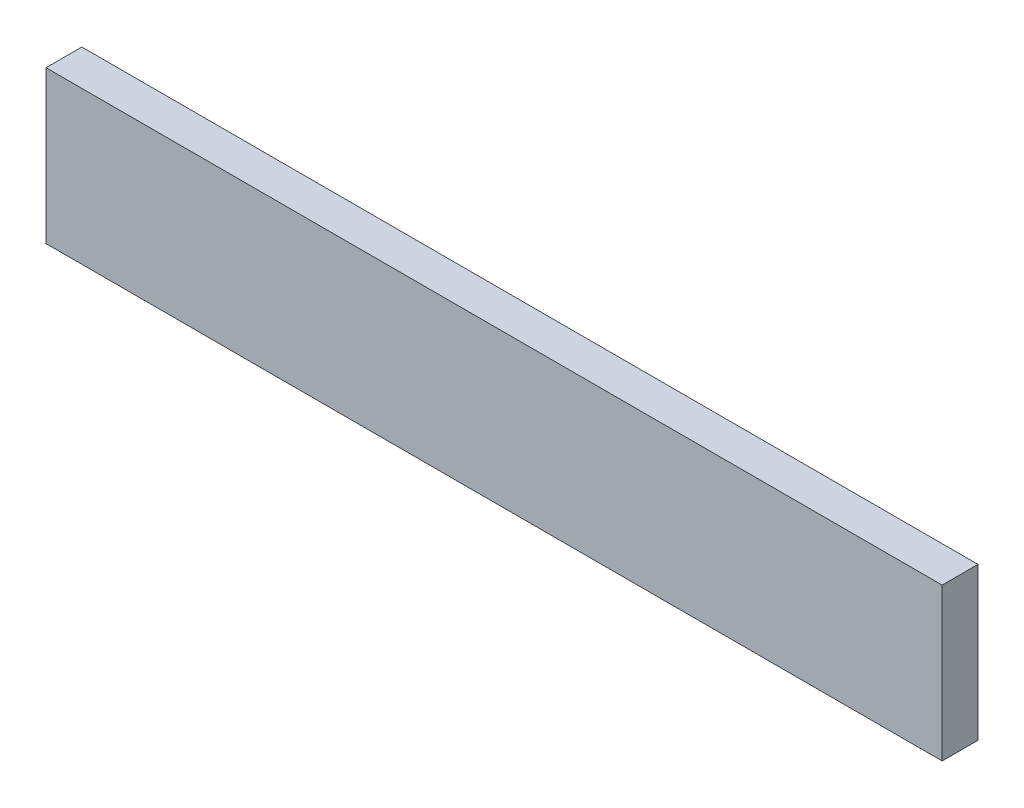
ISO-10303-21;
HEADER;
FILE_DESCRIPTION(('STEP AP214'),'2;1');
FILE_NAME('part.step','',(''),(''),'','','');
FILE_SCHEMA(('AUTOMOTIVE_DESIGN { 1 0 10303 214 1 1 1 1 }'));
ENDSEC;
DATA;
#1=APPLICATION_CONTEXT('core data for automotive mechanical design processes');
#2=APPLICATION_PROTOCOL_DEFINITION('international standard','automotive_design',2000,#1);
#3=PRODUCT_CONTEXT('',#1,'mechanical');
#4=PRODUCT('Part','Part','',(#3));
#5=PRODUCT_RELATED_PRODUCT_CATEGORY('part','',(#4));
#6=PRODUCT_DEFINITION_FORMATION('','',#4);
#7=PRODUCT_DEFINITION_CONTEXT('part definition',#1,'design');
#8=PRODUCT_DEFINITION('design','',#6,#7);
#9=PRODUCT_DEFINITION_SHAPE('','',#8);
#10=(LENGTH_UNIT() NAMED_UNIT(*) SI_UNIT(.MILLI.,.METRE.));
#11=(NAMED_UNIT(*) PLANE_ANGLE_UNIT() SI_UNIT($,.RADIAN.));
#12=(NAMED_UNIT(*) SI_UNIT($,.STERADIAN.) SOLID_ANGLE_UNIT());
#13=UNCERTAINTY_MEASURE_WITH_UNIT(LENGTH_MEASURE(1.E-05),#10,'distance_accuracy_value','');
#14=(GEOMETRIC_REPRESENTATION_CONTEXT(3) GLOBAL_UNCERTAINTY_ASSIGNED_CONTEXT((#13)) GLOBAL_UNIT_ASSIGNED_CONTEXT((#10,
#11,#12)) REPRESENTATION_CONTEXT('',''));
#15=CARTESIAN_POINT('',(0.,0.,0.));
#16=DIRECTION('',(0.,0.,1.));
#17=DIRECTION('',(1.,0.,0.));
#18=AXIS2_PLACEMENT_3D('',#15,#16,#17);
#19=CARTESIAN_POINT('',(0.,0.,20.));
#20=DIRECTION('',(0.,0.,1.));
#21=DIRECTION('',(1.,0.,0.));
#22=AXIS2_PLACEMENT_3D('',#19,#20,#21);
#23=PLANE('',#22);
#24=DIRECTION('',(-1.,0.,0.));
#25=VECTOR('',#24,1.);
#26=CARTESIAN_POINT('',(0.,-42.5,20.));
#27=LINE('',#26,#25);
#28=CARTESIAN_POINT('',(250.,-42.5,20.));
#29=VERTEX_POINT('',#28);
#30=CARTESIAN_POINT('',(-250.,-42.5,20.));
#31=VERTEX_POINT('',#30);
#32=EDGE_CURVE('E11',#29,#31,#27,.T.);
#33=ORIENTED_EDGE('',*,*,#32,.F.);
#34=DIRECTION('',(0.,-1.,0.));
#35=VECTOR('',#34,1.);
#36=CARTESIAN_POINT('',(250.,0.,20.));
#37=LINE('',#36,#35);
#38=CARTESIAN_POINT('',(250.,42.5,20.));
#39=VERTEX_POINT('',#38);
#40=EDGE_CURVE('E62',#39,#29,#37,.T.);
#41=ORIENTED_EDGE('',*,*,#40,.F.);
#42=DIRECTION('',(1.,0.,0.));
#43=VECTOR('',#42,1.);
#44=CARTESIAN_POINT('',(0.,42.5,20.));
#45=LINE('',#44,#43);
#46=CARTESIAN_POINT('',(-250.,42.5,20.));
#47=VERTEX_POINT('',#46);
#48=EDGE_CURVE('E98',#47,#39,#45,.T.);
#49=ORIENTED_EDGE('',*,*,#48,.F.);
#50=DIRECTION('',(0.,1.,0.));
#51=VECTOR('',#50,1.);
#52=CARTESIAN_POINT('',(-250.,0.,20.));
#53=LINE('',#52,#51);
#54=EDGE_CURVE('E25',#31,#47,#53,.T.);
#55=ORIENTED_EDGE('',*,*,#54,.F.);
#56=EDGE_LOOP('',(#33,#41,#49,#55));
#57=FACE_BOUND('',#56,.T.);
#58=ADVANCED_FACE('F17',(#57),#23,.T.);
#59=CARTESIAN_POINT('',(0.,-42.5,0.));
#60=DIRECTION('',(0.,-1.,0.));
#61=DIRECTION('',(0.,0.,-1.));
#62=AXIS2_PLACEMENT_3D('',#59,#60,#61);
#63=PLANE('',#62);
#64=DIRECTION('',(0.,0.,1.));
#65=VECTOR('',#64,1.);
#66=CARTESIAN_POINT('',(250.,-42.5,0.));
#67=LINE('',#66,#65);
#68=CARTESIAN_POINT('',(250.,-42.5,0.));
#69=VERTEX_POINT('',#68);
#70=EDGE_CURVE('E55',#69,#29,#67,.T.);
#71=ORIENTED_EDGE('',*,*,#70,.T.);
#72=ORIENTED_EDGE('',*,*,#32,.T.);
#73=DIRECTION('',(0.,0.,1.));
#74=VECTOR('',#73,1.);
#75=CARTESIAN_POINT('',(-250.,-42.5,0.));
#76=LINE('',#75,#74);
#77=CARTESIAN_POINT('',(-250.,-42.5,0.));
#78=VERTEX_POINT('',#77);
#79=EDGE_CURVE('E69',#78,#31,#76,.T.);
#80=ORIENTED_EDGE('',*,*,#79,.F.);
#81=DIRECTION('',(1.,0.,0.));
#82=VECTOR('',#81,1.);
#83=CARTESIAN_POINT('',(0.,-42.5,0.));
#84=LINE('',#83,#82);
#85=EDGE_CURVE('E67',#78,#69,#84,.T.);
#86=ORIENTED_EDGE('',*,*,#85,.T.);
#87=EDGE_LOOP('',(#71,#72,#80,#86));
#88=FACE_BOUND('',#87,.T.);
#89=ADVANCED_FACE('F68',(#88),#63,.T.);
#90=CARTESIAN_POINT('',(-250.,0.,0.));
#91=DIRECTION('',(-1.,0.,0.));
#92=DIRECTION('',(0.,0.,1.));
#93=AXIS2_PLACEMENT_3D('',#90,#91,#92);
#94=PLANE('',#93);
#95=ORIENTED_EDGE('',*,*,#79,.T.);
#96=ORIENTED_EDGE('',*,*,#54,.T.);
#97=DIRECTION('',(0.,0.,1.));
#98=VECTOR('',#97,1.);
#99=CARTESIAN_POINT('',(-250.,42.5,0.));
#100=LINE('',#99,#98);
#101=CARTESIAN_POINT('',(-250.,42.5,0.));
#102=VERTEX_POINT('',#101);
#103=EDGE_CURVE('E92',#102,#47,#100,.T.);
#104=ORIENTED_EDGE('',*,*,#103,.F.);
#105=DIRECTION('',(0.,-1.,0.));
#106=VECTOR('',#105,1.);
#107=CARTESIAN_POINT('',(-250.,0.,0.));
#108=LINE('',#107,#106);
#109=EDGE_CURVE('E74',#102,#78,#108,.T.);
#110=ORIENTED_EDGE('',*,*,#109,.T.);
#111=EDGE_LOOP('',(#95,#96,#104,#110));
#112=FACE_BOUND('',#111,.T.);
#113=ADVANCED_FACE('F106',(#112),#94,.T.);
#114=CARTESIAN_POINT('',(0.,42.5,0.));
#115=DIRECTION('',(0.,1.,0.));
#116=DIRECTION('',(0.,0.,1.));
#117=AXIS2_PLACEMENT_3D('',#114,#115,#116);
#118=PLANE('',#117);
#119=ORIENTED_EDGE('',*,*,#103,.T.);
#120=ORIENTED_EDGE('',*,*,#48,.T.);
#121=DIRECTION('',(0.,0.,1.));
#122=VECTOR('',#121,1.);
#123=CARTESIAN_POINT('',(250.,42.5,0.));
#124=LINE('',#123,#122);
#125=CARTESIAN_POINT('',(250.,42.5,0.));
#126=VERTEX_POINT('',#125);
#127=EDGE_CURVE('E64',#126,#39,#124,.T.);
#128=ORIENTED_EDGE('',*,*,#127,.F.);
#129=DIRECTION('',(-1.,0.,0.));
#130=VECTOR('',#129,1.);
#131=CARTESIAN_POINT('',(0.,42.5,0.));
#132=LINE('',#131,#130);
#133=EDGE_CURVE('E79',#126,#102,#132,.T.);
#134=ORIENTED_EDGE('',*,*,#133,.T.);
#135=EDGE_LOOP('',(#119,#120,#128,#134));
#136=FACE_BOUND('',#135,.T.);
#137=ADVANCED_FACE('F104',(#136),#118,.T.);
#138=CARTESIAN_POINT('',(0.,0.,0.));
#139=DIRECTION('',(0.,0.,-1.));
#140=DIRECTION('',(-1.,0.,0.));
#141=AXIS2_PLACEMENT_3D('',#138,#139,#140);
#142=PLANE('',#141);
#143=DIRECTION('',(0.,1.,0.));
#144=VECTOR('',#143,1.);
#145=CARTESIAN_POINT('',(250.,0.,0.));
#146=LINE('',#145,#144);
#147=EDGE_CURVE('E60',#69,#126,#146,.T.);
#148=ORIENTED_EDGE('',*,*,#147,.F.);
#149=ORIENTED_EDGE('',*,*,#85,.F.);
#150=ORIENTED_EDGE('',*,*,#109,.F.);
#151=ORIENTED_EDGE('',*,*,#133,.F.);
#152=EDGE_LOOP('',(#148,#149,#150,#151));
#153=FACE_BOUND('',#152,.T.);
#154=ADVANCED_FACE('F77',(#153),#142,.T.);
#155=CARTESIAN_POINT('',(250.,0.,0.));
#156=DIRECTION('',(1.,0.,0.));
#157=DIRECTION('',(0.,0.,-1.));
#158=AXIS2_PLACEMENT_3D('',#155,#156,#157);
#159=PLANE('',#158);
#160=ORIENTED_EDGE('',*,*,#147,.T.);
#161=ORIENTED_EDGE('',*,*,#127,.T.);
#162=ORIENTED_EDGE('',*,*,#40,.T.);
#163=ORIENTED_EDGE('',*,*,#70,.F.);
#164=EDGE_LOOP('',(#160,#161,#162,#163));
#165=FACE_BOUND('',#164,.T.);
#166=ADVANCED_FACE('F57',(#165),#159,.T.);
#167=CLOSED_SHELL('',(#58,#89,#113,#137,#154,#166));
#168=MANIFOLD_SOLID_BREP('B1',#167);
#169=ADVANCED_BREP_SHAPE_REPRESENTATION('',(#18,#168),#14);
#170=SHAPE_DEFINITION_REPRESENTATION(#9,#169);
ENDSEC;
END-ISO-10303-21;
